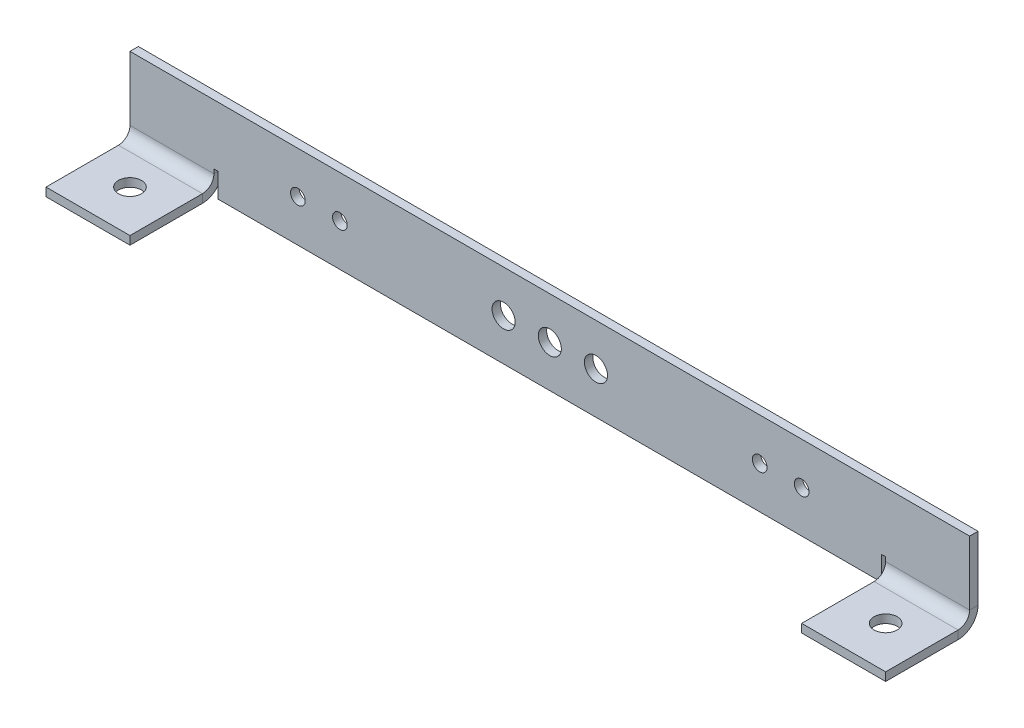
ISO-10303-21;
HEADER;
FILE_DESCRIPTION(('STEP AP214'),'2;1');
FILE_NAME('part.step','',(''),(''),'','','');
FILE_SCHEMA(('AUTOMOTIVE_DESIGN { 1 0 10303 214 1 1 1 1 }'));
ENDSEC;
DATA;
#1=APPLICATION_CONTEXT('core data for automotive mechanical design processes');
#2=APPLICATION_PROTOCOL_DEFINITION('international standard','automotive_design',2000,#1);
#3=PRODUCT_CONTEXT('',#1,'mechanical');
#4=PRODUCT('Part','Part','',(#3));
#5=PRODUCT_RELATED_PRODUCT_CATEGORY('part','',(#4));
#6=PRODUCT_DEFINITION_FORMATION('','',#4);
#7=PRODUCT_DEFINITION_CONTEXT('part definition',#1,'design');
#8=PRODUCT_DEFINITION('design','',#6,#7);
#9=PRODUCT_DEFINITION_SHAPE('','',#8);
#10=(LENGTH_UNIT() NAMED_UNIT(*) SI_UNIT(.MILLI.,.METRE.));
#11=(NAMED_UNIT(*) PLANE_ANGLE_UNIT() SI_UNIT($,.RADIAN.));
#12=(NAMED_UNIT(*) SI_UNIT($,.STERADIAN.) SOLID_ANGLE_UNIT());
#13=UNCERTAINTY_MEASURE_WITH_UNIT(LENGTH_MEASURE(1.E-05),#10,'distance_accuracy_value','');
#14=(GEOMETRIC_REPRESENTATION_CONTEXT(3) GLOBAL_UNCERTAINTY_ASSIGNED_CONTEXT((#13)) GLOBAL_UNIT_ASSIGNED_CONTEXT((#10,
#11,#12)) REPRESENTATION_CONTEXT('',''));
#15=CARTESIAN_POINT('',(0.,0.,0.));
#16=DIRECTION('',(0.,0.,1.));
#17=DIRECTION('',(1.,0.,0.));
#18=AXIS2_PLACEMENT_3D('',#15,#16,#17);
#19=CARTESIAN_POINT('',(100.,-20.,-2.));
#20=DIRECTION('',(0.,-1.,0.));
#21=DIRECTION('',(0.,0.,-1.));
#22=AXIS2_PLACEMENT_3D('',#19,#20,#21);
#23=PLANE('',#22);
#24=DIRECTION('',(1.,0.,0.));
#25=VECTOR('',#24,1.);
#26=CARTESIAN_POINT('',(100.,-20.,-2.));
#27=LINE('',#26,#25);
#28=CARTESIAN_POINT('',(-79.,-20.,-2.));
#29=VERTEX_POINT('',#28);
#30=CARTESIAN_POINT('',(79.,-20.,-2.));
#31=VERTEX_POINT('',#30);
#32=EDGE_CURVE('E358',#29,#31,#27,.T.);
#33=ORIENTED_EDGE('',*,*,#32,.T.);
#34=DIRECTION('',(0.,0.,-1.));
#35=VECTOR('',#34,1.);
#36=CARTESIAN_POINT('',(79.,-20.,0.));
#37=LINE('',#36,#35);
#38=CARTESIAN_POINT('',(79.,-20.,0.));
#39=VERTEX_POINT('',#38);
#40=EDGE_CURVE('E254',#39,#31,#37,.T.);
#41=ORIENTED_EDGE('',*,*,#40,.F.);
#42=DIRECTION('',(1.,0.,0.));
#43=VECTOR('',#42,1.);
#44=CARTESIAN_POINT('',(100.,-20.,0.));
#45=LINE('',#44,#43);
#46=CARTESIAN_POINT('',(-79.,-20.,0.));
#47=VERTEX_POINT('',#46);
#48=EDGE_CURVE('E129',#47,#39,#45,.T.);
#49=ORIENTED_EDGE('',*,*,#48,.F.);
#50=DIRECTION('',(0.,0.,-1.));
#51=VECTOR('',#50,1.);
#52=CARTESIAN_POINT('',(-79.,-20.,0.));
#53=LINE('',#52,#51);
#54=EDGE_CURVE('E339',#47,#29,#53,.T.);
#55=ORIENTED_EDGE('',*,*,#54,.T.);
#56=EDGE_LOOP('',(#33,#41,#49,#55));
#57=FACE_BOUND('',#56,.T.);
#58=ADVANCED_FACE('F78',(#57),#23,.T.);
#59=CARTESIAN_POINT('',(0.,0.,-2.));
#60=DIRECTION('',(0.,0.,1.));
#61=DIRECTION('',(1.,0.,0.));
#62=AXIS2_PLACEMENT_3D('',#59,#60,#61);
#63=PLANE('',#62);
#64=CARTESIAN_POINT('',(-50.,-10.,-2.));
#65=DIRECTION('',(0.,0.,-1.));
#66=DIRECTION('',(1.,0.,0.));
#67=AXIS2_PLACEMENT_3D('',#64,#65,#66);
#68=CIRCLE('',#67,1.75);
#69=CARTESIAN_POINT('',(-48.25,-10.,-2.));
#70=VERTEX_POINT('',#69);
#71=EDGE_CURVE('E657',#70,#70,#68,.T.);
#72=ORIENTED_EDGE('',*,*,#71,.F.);
#73=EDGE_LOOP('',(#72));
#74=FACE_BOUND('',#73,.T.);
#75=CARTESIAN_POINT('',(-60.,-10.,-2.));
#76=DIRECTION('',(0.,0.,-1.));
#77=DIRECTION('',(1.,0.,0.));
#78=AXIS2_PLACEMENT_3D('',#75,#76,#77);
#79=CIRCLE('',#78,1.75);
#80=CARTESIAN_POINT('',(-58.25,-10.,-2.));
#81=VERTEX_POINT('',#80);
#82=EDGE_CURVE('E652',#81,#81,#79,.T.);
#83=ORIENTED_EDGE('',*,*,#82,.F.);
#84=EDGE_LOOP('',(#83));
#85=FACE_BOUND('',#84,.T.);
#86=CARTESIAN_POINT('',(50.,-10.,-2.));
#87=DIRECTION('',(0.,0.,-1.));
#88=DIRECTION('',(-1.,0.,0.));
#89=AXIS2_PLACEMENT_3D('',#86,#87,#88);
#90=CIRCLE('',#89,1.75);
#91=CARTESIAN_POINT('',(48.25,-10.,-2.));
#92=VERTEX_POINT('',#91);
#93=EDGE_CURVE('E649',#92,#92,#90,.T.);
#94=ORIENTED_EDGE('',*,*,#93,.F.);
#95=EDGE_LOOP('',(#94));
#96=FACE_BOUND('',#95,.T.);
#97=CARTESIAN_POINT('',(11.,-10.,-2.));
#98=DIRECTION('',(0.,0.,-1.));
#99=DIRECTION('',(-1.,0.,0.));
#100=AXIS2_PLACEMENT_3D('',#97,#98,#99);
#101=CIRCLE('',#100,2.75);
#102=CARTESIAN_POINT('',(8.25,-10.,-2.));
#103=VERTEX_POINT('',#102);
#104=EDGE_CURVE('E158',#103,#103,#101,.T.);
#105=ORIENTED_EDGE('',*,*,#104,.F.);
#106=EDGE_LOOP('',(#105));
#107=FACE_BOUND('',#106,.T.);
#108=CARTESIAN_POINT('',(-11.,-10.,-2.));
#109=DIRECTION('',(0.,0.,-1.));
#110=DIRECTION('',(1.,0.,0.));
#111=AXIS2_PLACEMENT_3D('',#108,#109,#110);
#112=CIRCLE('',#111,2.75);
#113=CARTESIAN_POINT('',(-8.25,-10.,-2.));
#114=VERTEX_POINT('',#113);
#115=EDGE_CURVE('E655',#114,#114,#112,.T.);
#116=ORIENTED_EDGE('',*,*,#115,.F.);
#117=EDGE_LOOP('',(#116));
#118=FACE_BOUND('',#117,.T.);
#119=CARTESIAN_POINT('',(60.,-10.,-2.));
#120=DIRECTION('',(0.,0.,-1.));
#121=DIRECTION('',(-1.,0.,0.));
#122=AXIS2_PLACEMENT_3D('',#119,#120,#121);
#123=CIRCLE('',#122,1.75);
#124=CARTESIAN_POINT('',(58.25,-10.,-2.));
#125=VERTEX_POINT('',#124);
#126=EDGE_CURVE('E651',#125,#125,#123,.T.);
#127=ORIENTED_EDGE('',*,*,#126,.F.);
#128=EDGE_LOOP('',(#127));
#129=FACE_BOUND('',#128,.T.);
#130=CARTESIAN_POINT('',(0.,-10.,-2.));
#131=DIRECTION('',(0.,0.,-1.));
#132=DIRECTION('',(-1.,0.,0.));
#133=AXIS2_PLACEMENT_3D('',#130,#131,#132);
#134=CIRCLE('',#133,2.75);
#135=CARTESIAN_POINT('',(-2.75,-10.,-2.));
#136=VERTEX_POINT('',#135);
#137=EDGE_CURVE('E153',#136,#136,#134,.T.);
#138=ORIENTED_EDGE('',*,*,#137,.F.);
#139=EDGE_LOOP('',(#138));
#140=FACE_BOUND('',#139,.T.);
#141=DIRECTION('',(1.,0.,0.));
#142=VECTOR('',#141,1.);
#143=CARTESIAN_POINT('',(100.,-15.2634,-2.));
#144=LINE('',#143,#142);
#145=CARTESIAN_POINT('',(100.,-15.2634,-2.));
#146=VERTEX_POINT('',#145);
#147=CARTESIAN_POINT('',(80.,-15.2634,-2.));
#148=VERTEX_POINT('',#147);
#149=EDGE_CURVE('E222',#146,#148,#144,.F.);
#150=ORIENTED_EDGE('',*,*,#149,.T.);
#151=DIRECTION('',(0.,-1.,0.));
#152=VECTOR('',#151,1.);
#153=CARTESIAN_POINT('',(80.,0.,-2.));
#154=LINE('',#153,#152);
#155=CARTESIAN_POINT('',(80.,-14.2634,-2.));
#156=VERTEX_POINT('',#155);
#157=EDGE_CURVE('E266',#156,#148,#154,.T.);
#158=ORIENTED_EDGE('',*,*,#157,.F.);
#159=DIRECTION('',(1.,0.,0.));
#160=VECTOR('',#159,1.);
#161=CARTESIAN_POINT('',(0.,-14.2634,-2.));
#162=LINE('',#161,#160);
#163=CARTESIAN_POINT('',(79.,-14.2634,-2.));
#164=VERTEX_POINT('',#163);
#165=EDGE_CURVE('E263',#164,#156,#162,.T.);
#166=ORIENTED_EDGE('',*,*,#165,.F.);
#167=DIRECTION('',(0.,1.,0.));
#168=VECTOR('',#167,1.);
#169=CARTESIAN_POINT('',(79.,0.,-2.));
#170=LINE('',#169,#168);
#171=EDGE_CURVE('E246',#31,#164,#170,.T.);
#172=ORIENTED_EDGE('',*,*,#171,.F.);
#173=ORIENTED_EDGE('',*,*,#32,.F.);
#174=DIRECTION('',(0.,-1.,0.));
#175=VECTOR('',#174,1.);
#176=CARTESIAN_POINT('',(-79.,-1.91114115820755E-13,-2.));
#177=LINE('',#176,#175);
#178=CARTESIAN_POINT('',(-79.,-14.2634,-2.));
#179=VERTEX_POINT('',#178);
#180=EDGE_CURVE('E137',#179,#29,#177,.T.);
#181=ORIENTED_EDGE('',*,*,#180,.F.);
#182=DIRECTION('',(1.,0.,0.));
#183=VECTOR('',#182,1.);
#184=CARTESIAN_POINT('',(0.,-14.2634,-2.));
#185=LINE('',#184,#183);
#186=CARTESIAN_POINT('',(-80.,-14.2634,-2.));
#187=VERTEX_POINT('',#186);
#188=EDGE_CURVE('E141',#187,#179,#185,.T.);
#189=ORIENTED_EDGE('',*,*,#188,.F.);
#190=DIRECTION('',(0.,1.,0.));
#191=VECTOR('',#190,1.);
#192=CARTESIAN_POINT('',(-80.,0.,-2.));
#193=LINE('',#192,#191);
#194=CARTESIAN_POINT('',(-80.,-15.2634,-2.));
#195=VERTEX_POINT('',#194);
#196=EDGE_CURVE('E338',#195,#187,#193,.T.);
#197=ORIENTED_EDGE('',*,*,#196,.F.);
#198=DIRECTION('',(1.,0.,0.));
#199=VECTOR('',#198,1.);
#200=CARTESIAN_POINT('',(-80.,-15.2634,-2.));
#201=LINE('',#200,#199);
#202=CARTESIAN_POINT('',(-100.,-15.2634,-2.));
#203=VERTEX_POINT('',#202);
#204=EDGE_CURVE('E312',#195,#203,#201,.F.);
#205=ORIENTED_EDGE('',*,*,#204,.T.);
#206=DIRECTION('',(0.,-1.,0.));
#207=VECTOR('',#206,1.);
#208=CARTESIAN_POINT('',(-100.,-20.,-2.));
#209=LINE('',#208,#207);
#210=CARTESIAN_POINT('',(-100.,0.,-2.));
#211=VERTEX_POINT('',#210);
#212=EDGE_CURVE('E356',#211,#203,#209,.T.);
#213=ORIENTED_EDGE('',*,*,#212,.F.);
#214=DIRECTION('',(-1.,0.,0.));
#215=VECTOR('',#214,1.);
#216=CARTESIAN_POINT('',(-100.,0.,-2.));
#217=LINE('',#216,#215);
#218=CARTESIAN_POINT('',(100.,0.,-2.));
#219=VERTEX_POINT('',#218);
#220=EDGE_CURVE('E128',#219,#211,#217,.T.);
#221=ORIENTED_EDGE('',*,*,#220,.F.);
#222=DIRECTION('',(0.,1.,0.));
#223=VECTOR('',#222,1.);
#224=CARTESIAN_POINT('',(100.,-20.,-2.));
#225=LINE('',#224,#223);
#226=EDGE_CURVE('E103',#146,#219,#225,.T.);
#227=ORIENTED_EDGE('',*,*,#226,.F.);
#228=EDGE_LOOP('',(#150,#158,#166,#172,#173,#181,#189,#197,#205,#213,#221,#227));
#229=FACE_BOUND('',#228,.T.);
#230=ADVANCED_FACE('F373',(#74,#85,#96,#107,#118,#129,#140,#229),#63,.F.);
#231=CARTESIAN_POINT('',(0.,0.,0.));
#232=DIRECTION('',(0.,0.,1.));
#233=DIRECTION('',(1.,0.,0.));
#234=AXIS2_PLACEMENT_3D('',#231,#232,#233);
#235=PLANE('',#234);
#236=CARTESIAN_POINT('',(-50.,-10.,0.));
#237=DIRECTION('',(0.,0.,1.));
#238=DIRECTION('',(1.,0.,0.));
#239=AXIS2_PLACEMENT_3D('',#236,#237,#238);
#240=CIRCLE('',#239,1.75);
#241=CARTESIAN_POINT('',(-48.25,-10.,0.));
#242=VERTEX_POINT('',#241);
#243=EDGE_CURVE('E82',#242,#242,#240,.T.);
#244=ORIENTED_EDGE('',*,*,#243,.F.);
#245=EDGE_LOOP('',(#244));
#246=FACE_BOUND('',#245,.T.);
#247=CARTESIAN_POINT('',(-60.,-10.,0.));
#248=DIRECTION('',(0.,0.,1.));
#249=DIRECTION('',(1.,0.,0.));
#250=AXIS2_PLACEMENT_3D('',#247,#248,#249);
#251=CIRCLE('',#250,1.75);
#252=CARTESIAN_POINT('',(-58.25,-10.,0.));
#253=VERTEX_POINT('',#252);
#254=EDGE_CURVE('E166',#253,#253,#251,.T.);
#255=ORIENTED_EDGE('',*,*,#254,.F.);
#256=EDGE_LOOP('',(#255));
#257=FACE_BOUND('',#256,.T.);
#258=CARTESIAN_POINT('',(50.,-10.,0.));
#259=DIRECTION('',(0.,0.,1.));
#260=DIRECTION('',(1.,0.,0.));
#261=AXIS2_PLACEMENT_3D('',#258,#259,#260);
#262=CIRCLE('',#261,1.75);
#263=CARTESIAN_POINT('',(51.75,-10.,0.));
#264=VERTEX_POINT('',#263);
#265=EDGE_CURVE('E164',#264,#264,#262,.T.);
#266=ORIENTED_EDGE('',*,*,#265,.F.);
#267=EDGE_LOOP('',(#266));
#268=FACE_BOUND('',#267,.T.);
#269=CARTESIAN_POINT('',(11.,-10.,0.));
#270=DIRECTION('',(0.,0.,1.));
#271=DIRECTION('',(1.,0.,0.));
#272=AXIS2_PLACEMENT_3D('',#269,#270,#271);
#273=CIRCLE('',#272,2.75);
#274=CARTESIAN_POINT('',(13.75,-10.,0.));
#275=VERTEX_POINT('',#274);
#276=EDGE_CURVE('E161',#275,#275,#273,.T.);
#277=ORIENTED_EDGE('',*,*,#276,.F.);
#278=EDGE_LOOP('',(#277));
#279=FACE_BOUND('',#278,.T.);
#280=CARTESIAN_POINT('',(-11.,-10.,0.));
#281=DIRECTION('',(0.,0.,1.));
#282=DIRECTION('',(1.,0.,0.));
#283=AXIS2_PLACEMENT_3D('',#280,#281,#282);
#284=CIRCLE('',#283,2.75);
#285=CARTESIAN_POINT('',(-8.25,-10.,0.));
#286=VERTEX_POINT('',#285);
#287=EDGE_CURVE('E157',#286,#286,#284,.T.);
#288=ORIENTED_EDGE('',*,*,#287,.F.);
#289=EDGE_LOOP('',(#288));
#290=FACE_BOUND('',#289,.T.);
#291=CARTESIAN_POINT('',(60.,-10.,0.));
#292=DIRECTION('',(0.,0.,1.));
#293=DIRECTION('',(1.,0.,0.));
#294=AXIS2_PLACEMENT_3D('',#291,#292,#293);
#295=CIRCLE('',#294,1.75);
#296=CARTESIAN_POINT('',(61.75,-10.,0.));
#297=VERTEX_POINT('',#296);
#298=EDGE_CURVE('E154',#297,#297,#295,.T.);
#299=ORIENTED_EDGE('',*,*,#298,.F.);
#300=EDGE_LOOP('',(#299));
#301=FACE_BOUND('',#300,.T.);
#302=CARTESIAN_POINT('',(0.,-10.,0.));
#303=DIRECTION('',(0.,0.,1.));
#304=DIRECTION('',(1.,0.,0.));
#305=AXIS2_PLACEMENT_3D('',#302,#303,#304);
#306=CIRCLE('',#305,2.75);
#307=CARTESIAN_POINT('',(2.75,-10.,0.));
#308=VERTEX_POINT('',#307);
#309=EDGE_CURVE('E149',#308,#308,#306,.T.);
#310=ORIENTED_EDGE('',*,*,#309,.F.);
#311=EDGE_LOOP('',(#310));
#312=FACE_BOUND('',#311,.T.);
#313=DIRECTION('',(0.,1.,0.));
#314=VECTOR('',#313,1.);
#315=CARTESIAN_POINT('',(80.,-15.2634,0.));
#316=LINE('',#315,#314);
#317=CARTESIAN_POINT('',(80.,-15.2634,0.));
#318=VERTEX_POINT('',#317);
#319=CARTESIAN_POINT('',(80.,-14.2634,0.));
#320=VERTEX_POINT('',#319);
#321=EDGE_CURVE('E243',#318,#320,#316,.T.);
#322=ORIENTED_EDGE('',*,*,#321,.F.);
#323=DIRECTION('',(1.,0.,0.));
#324=VECTOR('',#323,1.);
#325=CARTESIAN_POINT('',(100.,-15.2634,0.));
#326=LINE('',#325,#324);
#327=CARTESIAN_POINT('',(100.,-15.2634,0.));
#328=VERTEX_POINT('',#327);
#329=EDGE_CURVE('E126',#328,#318,#326,.F.);
#330=ORIENTED_EDGE('',*,*,#329,.F.);
#331=DIRECTION('',(0.,1.,0.));
#332=VECTOR('',#331,1.);
#333=CARTESIAN_POINT('',(100.,-20.,0.));
#334=LINE('',#333,#332);
#335=CARTESIAN_POINT('',(100.,0.,0.));
#336=VERTEX_POINT('',#335);
#337=EDGE_CURVE('E118',#328,#336,#334,.T.);
#338=ORIENTED_EDGE('',*,*,#337,.T.);
#339=DIRECTION('',(-1.,0.,0.));
#340=VECTOR('',#339,1.);
#341=CARTESIAN_POINT('',(-100.,0.,0.));
#342=LINE('',#341,#340);
#343=CARTESIAN_POINT('',(-100.,0.,0.));
#344=VERTEX_POINT('',#343);
#345=EDGE_CURVE('E123',#336,#344,#342,.T.);
#346=ORIENTED_EDGE('',*,*,#345,.T.);
#347=DIRECTION('',(0.,-1.,0.));
#348=VECTOR('',#347,1.);
#349=CARTESIAN_POINT('',(-100.,-20.,0.));
#350=LINE('',#349,#348);
#351=CARTESIAN_POINT('',(-100.,-15.2634,0.));
#352=VERTEX_POINT('',#351);
#353=EDGE_CURVE('E136',#344,#352,#350,.T.);
#354=ORIENTED_EDGE('',*,*,#353,.T.);
#355=DIRECTION('',(1.,0.,0.));
#356=VECTOR('',#355,1.);
#357=CARTESIAN_POINT('',(-80.,-15.2634,0.));
#358=LINE('',#357,#356);
#359=CARTESIAN_POINT('',(-80.,-15.2634,0.));
#360=VERTEX_POINT('',#359);
#361=EDGE_CURVE('E325',#360,#352,#358,.F.);
#362=ORIENTED_EDGE('',*,*,#361,.F.);
#363=DIRECTION('',(0.,-1.,0.));
#364=VECTOR('',#363,1.);
#365=CARTESIAN_POINT('',(-80.,-14.2634,0.));
#366=LINE('',#365,#364);
#367=CARTESIAN_POINT('',(-80.,-14.2634,0.));
#368=VERTEX_POINT('',#367);
#369=EDGE_CURVE('E95',#368,#360,#366,.T.);
#370=ORIENTED_EDGE('',*,*,#369,.F.);
#371=DIRECTION('',(-1.,0.,0.));
#372=VECTOR('',#371,1.);
#373=CARTESIAN_POINT('',(-79.,-14.2634,0.));
#374=LINE('',#373,#372);
#375=CARTESIAN_POINT('',(-79.,-14.2634,0.));
#376=VERTEX_POINT('',#375);
#377=EDGE_CURVE('E340',#376,#368,#374,.T.);
#378=ORIENTED_EDGE('',*,*,#377,.F.);
#379=DIRECTION('',(0.,1.,0.));
#380=VECTOR('',#379,1.);
#381=CARTESIAN_POINT('',(-79.,-20.,0.));
#382=LINE('',#381,#380);
#383=EDGE_CURVE('E335',#47,#376,#382,.T.);
#384=ORIENTED_EDGE('',*,*,#383,.F.);
#385=ORIENTED_EDGE('',*,*,#48,.T.);
#386=DIRECTION('',(0.,-1.,0.));
#387=VECTOR('',#386,1.);
#388=CARTESIAN_POINT('',(79.,-14.2634,0.));
#389=LINE('',#388,#387);
#390=CARTESIAN_POINT('',(79.,-14.2634,0.));
#391=VERTEX_POINT('',#390);
#392=EDGE_CURVE('E251',#391,#39,#389,.T.);
#393=ORIENTED_EDGE('',*,*,#392,.F.);
#394=DIRECTION('',(-1.,0.,0.));
#395=VECTOR('',#394,1.);
#396=CARTESIAN_POINT('',(80.,-14.2634,0.));
#397=LINE('',#396,#395);
#398=EDGE_CURVE('E247',#320,#391,#397,.T.);
#399=ORIENTED_EDGE('',*,*,#398,.F.);
#400=EDGE_LOOP('',(#322,#330,#338,#346,#354,#362,#370,#378,#384,#385,#393,#399));
#401=FACE_BOUND('',#400,.T.);
#402=ADVANCED_FACE('F120',(#246,#257,#268,#279,#290,#301,#312,#401),#235,.T.);
#403=CARTESIAN_POINT('',(100.,-20.,-2.));
#404=DIRECTION('',(1.,0.,0.));
#405=DIRECTION('',(0.,1.,0.));
#406=AXIS2_PLACEMENT_3D('',#403,#404,#405);
#407=PLANE('',#406);
#408=ORIENTED_EDGE('',*,*,#337,.F.);
#409=DIRECTION('',(0.,0.,-1.));
#410=VECTOR('',#409,1.);
#411=CARTESIAN_POINT('',(100.,-15.2634,0.));
#412=LINE('',#411,#410);
#413=EDGE_CURVE('E229',#328,#146,#412,.T.);
#414=ORIENTED_EDGE('',*,*,#413,.T.);
#415=ORIENTED_EDGE('',*,*,#226,.T.);
#416=DIRECTION('',(0.,0.,1.));
#417=VECTOR('',#416,1.);
#418=CARTESIAN_POINT('',(100.,0.,-2.));
#419=LINE('',#418,#417);
#420=EDGE_CURVE('E13',#219,#336,#419,.T.);
#421=ORIENTED_EDGE('',*,*,#420,.T.);
#422=EDGE_LOOP('',(#408,#414,#415,#421));
#423=FACE_BOUND('',#422,.T.);
#424=ADVANCED_FACE('F131',(#423),#407,.T.);
#425=CARTESIAN_POINT('',(-100.,0.,-2.));
#426=DIRECTION('',(0.,1.,0.));
#427=DIRECTION('',(0.,0.,1.));
#428=AXIS2_PLACEMENT_3D('',#425,#426,#427);
#429=PLANE('',#428);
#430=ORIENTED_EDGE('',*,*,#345,.F.);
#431=ORIENTED_EDGE('',*,*,#420,.F.);
#432=ORIENTED_EDGE('',*,*,#220,.T.);
#433=DIRECTION('',(0.,0.,1.));
#434=VECTOR('',#433,1.);
#435=CARTESIAN_POINT('',(-100.,0.,-2.));
#436=LINE('',#435,#434);
#437=EDGE_CURVE('E87',#211,#344,#436,.T.);
#438=ORIENTED_EDGE('',*,*,#437,.T.);
#439=EDGE_LOOP('',(#430,#431,#432,#438));
#440=FACE_BOUND('',#439,.T.);
#441=ADVANCED_FACE('F80',(#440),#429,.T.);
#442=CARTESIAN_POINT('',(-100.,-20.,-2.));
#443=DIRECTION('',(-1.,0.,0.));
#444=DIRECTION('',(0.,-1.,0.));
#445=AXIS2_PLACEMENT_3D('',#442,#443,#444);
#446=PLANE('',#445);
#447=DIRECTION('',(0.,0.,-1.));
#448=VECTOR('',#447,1.);
#449=CARTESIAN_POINT('',(-100.,-15.2634,0.));
#450=LINE('',#449,#448);
#451=EDGE_CURVE('E330',#352,#203,#450,.T.);
#452=ORIENTED_EDGE('',*,*,#451,.F.);
#453=ORIENTED_EDGE('',*,*,#353,.F.);
#454=ORIENTED_EDGE('',*,*,#437,.F.);
#455=ORIENTED_EDGE('',*,*,#212,.T.);
#456=EDGE_LOOP('',(#452,#453,#454,#455));
#457=FACE_BOUND('',#456,.T.);
#458=ADVANCED_FACE('F506',(#457),#446,.T.);
#459=CARTESIAN_POINT('',(-79.,-20.,0.));
#460=DIRECTION('',(-1.,0.,0.));
#461=DIRECTION('',(0.,-1.,0.));
#462=AXIS2_PLACEMENT_3D('',#459,#460,#461);
#463=PLANE('',#462);
#464=DIRECTION('',(0.,0.,-1.));
#465=VECTOR('',#464,1.);
#466=CARTESIAN_POINT('',(-79.,-14.2634,0.));
#467=LINE('',#466,#465);
#468=EDGE_CURVE('E343',#376,#179,#467,.T.);
#469=ORIENTED_EDGE('',*,*,#468,.T.);
#470=ORIENTED_EDGE('',*,*,#180,.T.);
#471=ORIENTED_EDGE('',*,*,#54,.F.);
#472=ORIENTED_EDGE('',*,*,#383,.T.);
#473=EDGE_LOOP('',(#469,#470,#471,#472));
#474=FACE_BOUND('',#473,.T.);
#475=ADVANCED_FACE('F508',(#474),#463,.T.);
#476=CARTESIAN_POINT('',(-79.,-14.2634,0.));
#477=DIRECTION('',(0.,-1.,0.));
#478=DIRECTION('',(0.,0.,-1.));
#479=AXIS2_PLACEMENT_3D('',#476,#477,#478);
#480=PLANE('',#479);
#481=DIRECTION('',(0.,0.,-1.));
#482=VECTOR('',#481,1.);
#483=CARTESIAN_POINT('',(-80.,-14.2634,0.));
#484=LINE('',#483,#482);
#485=EDGE_CURVE('E333',#368,#187,#484,.T.);
#486=ORIENTED_EDGE('',*,*,#485,.T.);
#487=ORIENTED_EDGE('',*,*,#188,.T.);
#488=ORIENTED_EDGE('',*,*,#468,.F.);
#489=ORIENTED_EDGE('',*,*,#377,.T.);
#490=EDGE_LOOP('',(#486,#487,#488,#489));
#491=FACE_BOUND('',#490,.T.);
#492=ADVANCED_FACE('F514',(#491),#480,.T.);
#493=CARTESIAN_POINT('',(-80.,-14.2634,0.));
#494=DIRECTION('',(1.,0.,0.));
#495=DIRECTION('',(0.,0.,-1.));
#496=AXIS2_PLACEMENT_3D('',#493,#494,#495);
#497=PLANE('',#496);
#498=DIRECTION('',(0.,0.,-1.));
#499=VECTOR('',#498,1.);
#500=CARTESIAN_POINT('',(-80.,-15.2634,0.));
#501=LINE('',#500,#499);
#502=EDGE_CURVE('E319',#360,#195,#501,.T.);
#503=ORIENTED_EDGE('',*,*,#502,.T.);
#504=ORIENTED_EDGE('',*,*,#196,.T.);
#505=ORIENTED_EDGE('',*,*,#485,.F.);
#506=ORIENTED_EDGE('',*,*,#369,.T.);
#507=EDGE_LOOP('',(#503,#504,#505,#506));
#508=FACE_BOUND('',#507,.T.);
#509=ADVANCED_FACE('F547',(#508),#497,.T.);
#510=CARTESIAN_POINT('',(-100.,-15.2634,2.7366));
#511=DIRECTION('',(-1.,0.,0.));
#512=DIRECTION('',(0.,0.,1.));
#513=AXIS2_PLACEMENT_3D('',#510,#511,#512);
#514=PLANE('',#513);
#515=DIRECTION('',(0.,-1.,0.));
#516=VECTOR('',#515,1.);
#517=CARTESIAN_POINT('',(-100.,-20.,2.73659999999999));
#518=LINE('',#517,#516);
#519=CARTESIAN_POINT('',(-100.,-18.,2.73659999999999));
#520=VERTEX_POINT('',#519);
#521=CARTESIAN_POINT('',(-100.,-20.,2.73659999999998));
#522=VERTEX_POINT('',#521);
#523=EDGE_CURVE('E275',#520,#522,#518,.T.);
#524=ORIENTED_EDGE('',*,*,#523,.F.);
#525=CARTESIAN_POINT('',(-100.,-15.2634,2.7366));
#526=DIRECTION('',(1.,0.,0.));
#527=DIRECTION('',(0.,0.,-1.));
#528=AXIS2_PLACEMENT_3D('',#525,#526,#527);
#529=CIRCLE('',#528,2.7366);
#530=EDGE_CURVE('E322',#352,#520,#529,.F.);
#531=ORIENTED_EDGE('',*,*,#530,.F.);
#532=ORIENTED_EDGE('',*,*,#451,.T.);
#533=CARTESIAN_POINT('',(-100.,-15.2634,2.7366));
#534=DIRECTION('',(1.,0.,0.));
#535=DIRECTION('',(0.,0.,-1.));
#536=AXIS2_PLACEMENT_3D('',#533,#534,#535);
#537=CIRCLE('',#536,4.7366);
#538=EDGE_CURVE('E315',#203,#522,#537,.F.);
#539=ORIENTED_EDGE('',*,*,#538,.T.);
#540=EDGE_LOOP('',(#524,#531,#532,#539));
#541=FACE_BOUND('',#540,.T.);
#542=ADVANCED_FACE('F525',(#541),#514,.T.);
#543=CARTESIAN_POINT('',(-80.,-15.2634,2.7366));
#544=DIRECTION('',(-1.,0.,0.));
#545=DIRECTION('',(0.,0.,1.));
#546=AXIS2_PLACEMENT_3D('',#543,#544,#545);
#547=PLANE('',#546);
#548=CARTESIAN_POINT('',(-80.,-15.2634,2.7366));
#549=DIRECTION('',(1.,0.,0.));
#550=DIRECTION('',(0.,0.,-1.));
#551=AXIS2_PLACEMENT_3D('',#548,#549,#550);
#552=CIRCLE('',#551,2.7366);
#553=CARTESIAN_POINT('',(-80.,-18.,2.73659999999999));
#554=VERTEX_POINT('',#553);
#555=EDGE_CURVE('E279',#554,#360,#552,.T.);
#556=ORIENTED_EDGE('',*,*,#555,.F.);
#557=DIRECTION('',(0.,-1.,0.));
#558=VECTOR('',#557,1.);
#559=CARTESIAN_POINT('',(-80.,-18.,2.73659999999999));
#560=LINE('',#559,#558);
#561=CARTESIAN_POINT('',(-80.,-20.,2.73659999999998));
#562=VERTEX_POINT('',#561);
#563=EDGE_CURVE('E304',#554,#562,#560,.T.);
#564=ORIENTED_EDGE('',*,*,#563,.T.);
#565=CARTESIAN_POINT('',(-80.,-15.2634,2.7366));
#566=DIRECTION('',(1.,0.,0.));
#567=DIRECTION('',(0.,0.,-1.));
#568=AXIS2_PLACEMENT_3D('',#565,#566,#567);
#569=CIRCLE('',#568,4.7366);
#570=EDGE_CURVE('E316',#562,#195,#569,.T.);
#571=ORIENTED_EDGE('',*,*,#570,.T.);
#572=ORIENTED_EDGE('',*,*,#502,.F.);
#573=EDGE_LOOP('',(#556,#564,#571,#572));
#574=FACE_BOUND('',#573,.T.);
#575=ADVANCED_FACE('F545',(#574),#547,.F.);
#576=CARTESIAN_POINT('',(-80.,-15.2634,2.7366));
#577=DIRECTION('',(1.,0.,0.));
#578=DIRECTION('',(0.,-1.,0.));
#579=AXIS2_PLACEMENT_3D('',#576,#577,#578);
#580=CYLINDRICAL_SURFACE('',#579,4.7366);
#581=ORIENTED_EDGE('',*,*,#204,.F.);
#582=ORIENTED_EDGE('',*,*,#570,.F.);
#583=DIRECTION('',(1.,0.,0.));
#584=VECTOR('',#583,1.);
#585=CARTESIAN_POINT('',(0.,-20.,2.73659999999997));
#586=LINE('',#585,#584);
#587=EDGE_CURVE('E301',#522,#562,#586,.T.);
#588=ORIENTED_EDGE('',*,*,#587,.F.);
#589=ORIENTED_EDGE('',*,*,#538,.F.);
#590=EDGE_LOOP('',(#581,#582,#588,#589));
#591=FACE_BOUND('',#590,.T.);
#592=ADVANCED_FACE('F549',(#591),#580,.T.);
#593=CARTESIAN_POINT('',(-80.,-15.2634,2.7366));
#594=DIRECTION('',(1.,0.,0.));
#595=DIRECTION('',(0.,-1.,0.));
#596=AXIS2_PLACEMENT_3D('',#593,#594,#595);
#597=CYLINDRICAL_SURFACE('',#596,2.7366);
#598=ORIENTED_EDGE('',*,*,#361,.T.);
#599=ORIENTED_EDGE('',*,*,#530,.T.);
#600=DIRECTION('',(-1.,0.,0.));
#601=VECTOR('',#600,1.);
#602=CARTESIAN_POINT('',(-100.,-18.,2.73659999999999));
#603=LINE('',#602,#601);
#604=EDGE_CURVE('E307',#520,#554,#603,.F.);
#605=ORIENTED_EDGE('',*,*,#604,.T.);
#606=ORIENTED_EDGE('',*,*,#555,.T.);
#607=EDGE_LOOP('',(#598,#599,#605,#606));
#608=FACE_BOUND('',#607,.T.);
#609=ADVANCED_FACE('F522',(#608),#597,.F.);
#610=CARTESIAN_POINT('',(-80.,-20.,0.));
#611=DIRECTION('',(1.,0.,0.));
#612=DIRECTION('',(0.,0.,-1.));
#613=AXIS2_PLACEMENT_3D('',#610,#611,#612);
#614=PLANE('',#613);
#615=DIRECTION('',(0.,0.,-1.));
#616=VECTOR('',#615,1.);
#617=CARTESIAN_POINT('',(-80.,-20.,0.));
#618=LINE('',#617,#616);
#619=CARTESIAN_POINT('',(-80.,-20.0000000000001,20.));
#620=VERTEX_POINT('',#619);
#621=EDGE_CURVE('E283',#620,#562,#618,.T.);
#622=ORIENTED_EDGE('',*,*,#621,.T.);
#623=ORIENTED_EDGE('',*,*,#563,.F.);
#624=DIRECTION('',(0.,0.,1.));
#625=VECTOR('',#624,1.);
#626=CARTESIAN_POINT('',(-80.,-18.,0.));
#627=LINE('',#626,#625);
#628=CARTESIAN_POINT('',(-80.,-18.0000000000001,20.));
#629=VERTEX_POINT('',#628);
#630=EDGE_CURVE('E292',#629,#554,#627,.F.);
#631=ORIENTED_EDGE('',*,*,#630,.F.);
#632=DIRECTION('',(0.,1.,0.));
#633=VECTOR('',#632,1.);
#634=CARTESIAN_POINT('',(-80.,-20.0000000000001,20.));
#635=LINE('',#634,#633);
#636=EDGE_CURVE('E276',#620,#629,#635,.T.);
#637=ORIENTED_EDGE('',*,*,#636,.F.);
#638=EDGE_LOOP('',(#622,#623,#631,#637));
#639=FACE_BOUND('',#638,.T.);
#640=ADVANCED_FACE('F543',(#639),#614,.T.);
#641=CARTESIAN_POINT('',(-100.,-20.0000000000001,20.));
#642=DIRECTION('',(-1.,0.,0.));
#643=DIRECTION('',(0.,0.,1.));
#644=AXIS2_PLACEMENT_3D('',#641,#642,#643);
#645=PLANE('',#644);
#646=DIRECTION('',(0.,0.,-1.));
#647=VECTOR('',#646,1.);
#648=CARTESIAN_POINT('',(-100.,-18.,0.));
#649=LINE('',#648,#647);
#650=CARTESIAN_POINT('',(-100.,-18.0000000000001,20.));
#651=VERTEX_POINT('',#650);
#652=EDGE_CURVE('E298',#520,#651,#649,.F.);
#653=ORIENTED_EDGE('',*,*,#652,.F.);
#654=ORIENTED_EDGE('',*,*,#523,.T.);
#655=DIRECTION('',(0.,0.,1.));
#656=VECTOR('',#655,1.);
#657=CARTESIAN_POINT('',(-100.,-20.0000000000001,20.));
#658=LINE('',#657,#656);
#659=CARTESIAN_POINT('',(-100.,-20.0000000000001,20.));
#660=VERTEX_POINT('',#659);
#661=EDGE_CURVE('E289',#522,#660,#658,.T.);
#662=ORIENTED_EDGE('',*,*,#661,.T.);
#663=DIRECTION('',(0.,1.,0.));
#664=VECTOR('',#663,1.);
#665=CARTESIAN_POINT('',(-100.,-20.0000000000001,20.));
#666=LINE('',#665,#664);
#667=EDGE_CURVE('E280',#660,#651,#666,.T.);
#668=ORIENTED_EDGE('',*,*,#667,.T.);
#669=EDGE_LOOP('',(#653,#654,#662,#668));
#670=FACE_BOUND('',#669,.T.);
#671=ADVANCED_FACE('F529',(#670),#645,.T.);
#672=CARTESIAN_POINT('',(0.,-20.,0.));
#673=DIRECTION('',(0.,-1.,0.));
#674=DIRECTION('',(0.,0.,-1.));
#675=AXIS2_PLACEMENT_3D('',#672,#673,#674);
#676=PLANE('',#675);
#677=CARTESIAN_POINT('',(-90.,-20.,9.99999999999999));
#678=DIRECTION('',(0.,-1.,0.));
#679=DIRECTION('',(0.,0.,-1.));
#680=AXIS2_PLACEMENT_3D('',#677,#678,#679);
#681=CIRCLE('',#680,2.75000000000001);
#682=CARTESIAN_POINT('',(-90.,-20.,7.24999999999998));
#683=VERTEX_POINT('',#682);
#684=EDGE_CURVE('E272',#683,#683,#681,.T.);
#685=ORIENTED_EDGE('',*,*,#684,.F.);
#686=EDGE_LOOP('',(#685));
#687=FACE_BOUND('',#686,.T.);
#688=ORIENTED_EDGE('',*,*,#661,.F.);
#689=ORIENTED_EDGE('',*,*,#587,.T.);
#690=ORIENTED_EDGE('',*,*,#621,.F.);
#691=DIRECTION('',(1.,0.,0.));
#692=VECTOR('',#691,1.);
#693=CARTESIAN_POINT('',(-80.,-20.0000000000001,20.));
#694=LINE('',#693,#692);
#695=EDGE_CURVE('E286',#660,#620,#694,.T.);
#696=ORIENTED_EDGE('',*,*,#695,.F.);
#697=EDGE_LOOP('',(#688,#689,#690,#696));
#698=FACE_BOUND('',#697,.T.);
#699=ADVANCED_FACE('F533',(#687,#698),#676,.T.);
#700=CARTESIAN_POINT('',(0.,-18.,0.));
#701=DIRECTION('',(0.,-1.,0.));
#702=DIRECTION('',(0.,0.,-1.));
#703=AXIS2_PLACEMENT_3D('',#700,#701,#702);
#704=PLANE('',#703);
#705=CARTESIAN_POINT('',(-90.,-18.,10.));
#706=DIRECTION('',(0.,1.,0.));
#707=DIRECTION('',(0.,0.,1.));
#708=AXIS2_PLACEMENT_3D('',#705,#706,#707);
#709=CIRCLE('',#708,2.75000000000001);
#710=CARTESIAN_POINT('',(-90.,-18.,12.75));
#711=VERTEX_POINT('',#710);
#712=EDGE_CURVE('E269',#711,#711,#709,.T.);
#713=ORIENTED_EDGE('',*,*,#712,.F.);
#714=EDGE_LOOP('',(#713));
#715=FACE_BOUND('',#714,.T.);
#716=ORIENTED_EDGE('',*,*,#604,.F.);
#717=ORIENTED_EDGE('',*,*,#652,.T.);
#718=DIRECTION('',(-1.,0.,0.));
#719=VECTOR('',#718,1.);
#720=CARTESIAN_POINT('',(0.,-18.0000000000001,20.));
#721=LINE('',#720,#719);
#722=EDGE_CURVE('E295',#651,#629,#721,.F.);
#723=ORIENTED_EDGE('',*,*,#722,.T.);
#724=ORIENTED_EDGE('',*,*,#630,.T.);
#725=EDGE_LOOP('',(#716,#717,#723,#724));
#726=FACE_BOUND('',#725,.T.);
#727=ADVANCED_FACE('F540',(#715,#726),#704,.F.);
#728=CARTESIAN_POINT('',(-80.,-20.0000000000001,20.));
#729=DIRECTION('',(0.,0.,1.));
#730=DIRECTION('',(0.,-1.,0.));
#731=AXIS2_PLACEMENT_3D('',#728,#729,#730);
#732=PLANE('',#731);
#733=ORIENTED_EDGE('',*,*,#722,.F.);
#734=ORIENTED_EDGE('',*,*,#667,.F.);
#735=ORIENTED_EDGE('',*,*,#695,.T.);
#736=ORIENTED_EDGE('',*,*,#636,.T.);
#737=EDGE_LOOP('',(#733,#734,#735,#736));
#738=FACE_BOUND('',#737,.T.);
#739=ADVANCED_FACE('F537',(#738),#732,.T.);
#740=CARTESIAN_POINT('',(-90.,-28.,9.99999999999996));
#741=DIRECTION('',(0.,1.,0.));
#742=DIRECTION('',(0.,0.,1.));
#743=AXIS2_PLACEMENT_3D('',#740,#741,#742);
#744=CYLINDRICAL_SURFACE('',#743,2.75000000000001);
#745=ORIENTED_EDGE('',*,*,#684,.T.);
#746=EDGE_LOOP('',(#745));
#747=FACE_BOUND('',#746,.T.);
#748=ORIENTED_EDGE('',*,*,#712,.T.);
#749=EDGE_LOOP('',(#748));
#750=FACE_BOUND('',#749,.T.);
#751=ADVANCED_FACE('F563',(#747,#750),#744,.F.);
#752=CARTESIAN_POINT('',(80.,-15.2634,0.));
#753=DIRECTION('',(-1.,0.,0.));
#754=DIRECTION('',(0.,0.,1.));
#755=AXIS2_PLACEMENT_3D('',#752,#753,#754);
#756=PLANE('',#755);
#757=DIRECTION('',(0.,0.,-1.));
#758=VECTOR('',#757,1.);
#759=CARTESIAN_POINT('',(80.,-14.2634,0.));
#760=LINE('',#759,#758);
#761=EDGE_CURVE('E250',#320,#156,#760,.T.);
#762=ORIENTED_EDGE('',*,*,#761,.T.);
#763=ORIENTED_EDGE('',*,*,#157,.T.);
#764=DIRECTION('',(0.,0.,-1.));
#765=VECTOR('',#764,1.);
#766=CARTESIAN_POINT('',(80.,-15.2634,0.));
#767=LINE('',#766,#765);
#768=EDGE_CURVE('E238',#318,#148,#767,.T.);
#769=ORIENTED_EDGE('',*,*,#768,.F.);
#770=ORIENTED_EDGE('',*,*,#321,.T.);
#771=EDGE_LOOP('',(#762,#763,#769,#770));
#772=FACE_BOUND('',#771,.T.);
#773=ADVANCED_FACE('F561',(#772),#756,.T.);
#774=CARTESIAN_POINT('',(80.,-14.2634,0.));
#775=DIRECTION('',(0.,-1.,0.));
#776=DIRECTION('',(0.,0.,-1.));
#777=AXIS2_PLACEMENT_3D('',#774,#775,#776);
#778=PLANE('',#777);
#779=DIRECTION('',(0.,0.,-1.));
#780=VECTOR('',#779,1.);
#781=CARTESIAN_POINT('',(79.,-14.2634,0.));
#782=LINE('',#781,#780);
#783=EDGE_CURVE('E241',#391,#164,#782,.T.);
#784=ORIENTED_EDGE('',*,*,#783,.T.);
#785=ORIENTED_EDGE('',*,*,#165,.T.);
#786=ORIENTED_EDGE('',*,*,#761,.F.);
#787=ORIENTED_EDGE('',*,*,#398,.T.);
#788=EDGE_LOOP('',(#784,#785,#786,#787));
#789=FACE_BOUND('',#788,.T.);
#790=ADVANCED_FACE('F558',(#789),#778,.T.);
#791=CARTESIAN_POINT('',(79.,-14.2634,0.));
#792=DIRECTION('',(1.,0.,0.));
#793=DIRECTION('',(0.,0.,-1.));
#794=AXIS2_PLACEMENT_3D('',#791,#792,#793);
#795=PLANE('',#794);
#796=ORIENTED_EDGE('',*,*,#40,.T.);
#797=ORIENTED_EDGE('',*,*,#171,.T.);
#798=ORIENTED_EDGE('',*,*,#783,.F.);
#799=ORIENTED_EDGE('',*,*,#392,.T.);
#800=EDGE_LOOP('',(#796,#797,#798,#799));
#801=FACE_BOUND('',#800,.T.);
#802=ADVANCED_FACE('F556',(#801),#795,.T.);
#803=CARTESIAN_POINT('',(80.,-15.2634,2.7366));
#804=DIRECTION('',(-1.,0.,0.));
#805=DIRECTION('',(0.,0.,1.));
#806=AXIS2_PLACEMENT_3D('',#803,#804,#805);
#807=PLANE('',#806);
#808=DIRECTION('',(0.,1.,0.));
#809=VECTOR('',#808,1.);
#810=CARTESIAN_POINT('',(80.,-20.,2.73659999999998));
#811=LINE('',#810,#809);
#812=CARTESIAN_POINT('',(80.,-18.,2.73659999999999));
#813=VERTEX_POINT('',#812);
#814=CARTESIAN_POINT('',(80.,-20.,2.73659999999998));
#815=VERTEX_POINT('',#814);
#816=EDGE_CURVE('E185',#813,#815,#811,.F.);
#817=ORIENTED_EDGE('',*,*,#816,.F.);
#818=CARTESIAN_POINT('',(80.,-15.2634,2.7366));
#819=DIRECTION('',(1.,0.,0.));
#820=DIRECTION('',(0.,0.,-1.));
#821=AXIS2_PLACEMENT_3D('',#818,#819,#820);
#822=CIRCLE('',#821,2.7366);
#823=EDGE_CURVE('E232',#318,#813,#822,.F.);
#824=ORIENTED_EDGE('',*,*,#823,.F.);
#825=ORIENTED_EDGE('',*,*,#768,.T.);
#826=CARTESIAN_POINT('',(80.,-15.2634,2.7366));
#827=DIRECTION('',(1.,0.,0.));
#828=DIRECTION('',(0.,0.,-1.));
#829=AXIS2_PLACEMENT_3D('',#826,#827,#828);
#830=CIRCLE('',#829,4.7366);
#831=EDGE_CURVE('E225',#148,#815,#830,.F.);
#832=ORIENTED_EDGE('',*,*,#831,.T.);
#833=EDGE_LOOP('',(#817,#824,#825,#832));
#834=FACE_BOUND('',#833,.T.);
#835=ADVANCED_FACE('F478',(#834),#807,.T.);
#836=CARTESIAN_POINT('',(100.,-15.2634,2.7366));
#837=DIRECTION('',(-1.,0.,0.));
#838=DIRECTION('',(0.,0.,1.));
#839=AXIS2_PLACEMENT_3D('',#836,#837,#838);
#840=PLANE('',#839);
#841=CARTESIAN_POINT('',(100.,-15.2634,2.7366));
#842=DIRECTION('',(1.,0.,0.));
#843=DIRECTION('',(0.,0.,-1.));
#844=AXIS2_PLACEMENT_3D('',#841,#842,#843);
#845=CIRCLE('',#844,2.7366);
#846=CARTESIAN_POINT('',(100.,-18.,2.73659999999999));
#847=VERTEX_POINT('',#846);
#848=EDGE_CURVE('E189',#847,#328,#845,.T.);
#849=ORIENTED_EDGE('',*,*,#848,.F.);
#850=DIRECTION('',(0.,1.,0.));
#851=VECTOR('',#850,1.);
#852=CARTESIAN_POINT('',(100.,-18.,2.73659999999999));
#853=LINE('',#852,#851);
#854=CARTESIAN_POINT('',(100.,-20.,2.73659999999999));
#855=VERTEX_POINT('',#854);
#856=EDGE_CURVE('E214',#847,#855,#853,.F.);
#857=ORIENTED_EDGE('',*,*,#856,.T.);
#858=CARTESIAN_POINT('',(100.,-15.2634,2.7366));
#859=DIRECTION('',(1.,0.,0.));
#860=DIRECTION('',(0.,0.,-1.));
#861=AXIS2_PLACEMENT_3D('',#858,#859,#860);
#862=CIRCLE('',#861,4.7366);
#863=EDGE_CURVE('E226',#855,#146,#862,.T.);
#864=ORIENTED_EDGE('',*,*,#863,.T.);
#865=ORIENTED_EDGE('',*,*,#413,.F.);
#866=EDGE_LOOP('',(#849,#857,#864,#865));
#867=FACE_BOUND('',#866,.T.);
#868=ADVANCED_FACE('F459',(#867),#840,.F.);
#869=CARTESIAN_POINT('',(100.,-15.2634,2.7366));
#870=DIRECTION('',(1.,0.,0.));
#871=DIRECTION('',(0.,-1.,0.));
#872=AXIS2_PLACEMENT_3D('',#869,#870,#871);
#873=CYLINDRICAL_SURFACE('',#872,4.7366);
#874=ORIENTED_EDGE('',*,*,#149,.F.);
#875=ORIENTED_EDGE('',*,*,#863,.F.);
#876=DIRECTION('',(1.,0.,0.));
#877=VECTOR('',#876,1.);
#878=CARTESIAN_POINT('',(0.,-20.,2.73659999999997));
#879=LINE('',#878,#877);
#880=EDGE_CURVE('E211',#815,#855,#879,.T.);
#881=ORIENTED_EDGE('',*,*,#880,.F.);
#882=ORIENTED_EDGE('',*,*,#831,.F.);
#883=EDGE_LOOP('',(#874,#875,#881,#882));
#884=FACE_BOUND('',#883,.T.);
#885=ADVANCED_FACE('F454',(#884),#873,.T.);
#886=CARTESIAN_POINT('',(100.,-15.2634,2.7366));
#887=DIRECTION('',(1.,0.,0.));
#888=DIRECTION('',(0.,-1.,0.));
#889=AXIS2_PLACEMENT_3D('',#886,#887,#888);
#890=CYLINDRICAL_SURFACE('',#889,2.7366);
#891=ORIENTED_EDGE('',*,*,#329,.T.);
#892=ORIENTED_EDGE('',*,*,#823,.T.);
#893=DIRECTION('',(-1.,0.,0.));
#894=VECTOR('',#893,1.);
#895=CARTESIAN_POINT('',(80.,-18.,2.73659999999999));
#896=LINE('',#895,#894);
#897=EDGE_CURVE('E217',#813,#847,#896,.F.);
#898=ORIENTED_EDGE('',*,*,#897,.T.);
#899=ORIENTED_EDGE('',*,*,#848,.T.);
#900=EDGE_LOOP('',(#891,#892,#898,#899));
#901=FACE_BOUND('',#900,.T.);
#902=ADVANCED_FACE('F481',(#901),#890,.F.);
#903=CARTESIAN_POINT('',(100.,-20.0000000000001,20.));
#904=DIRECTION('',(-1.,0.,0.));
#905=DIRECTION('',(0.,0.,1.));
#906=AXIS2_PLACEMENT_3D('',#903,#904,#905);
#907=PLANE('',#906);
#908=ORIENTED_EDGE('',*,*,#856,.F.);
#909=DIRECTION('',(0.,0.,1.));
#910=VECTOR('',#909,1.);
#911=CARTESIAN_POINT('',(100.,-18.0000000000001,20.));
#912=LINE('',#911,#910);
#913=CARTESIAN_POINT('',(100.,-18.0000000000001,20.));
#914=VERTEX_POINT('',#913);
#915=EDGE_CURVE('E202',#847,#914,#912,.T.);
#916=ORIENTED_EDGE('',*,*,#915,.T.);
#917=DIRECTION('',(0.,1.,0.));
#918=VECTOR('',#917,1.);
#919=CARTESIAN_POINT('',(100.,-20.0000000000001,20.));
#920=LINE('',#919,#918);
#921=CARTESIAN_POINT('',(100.,-20.0000000000001,20.));
#922=VERTEX_POINT('',#921);
#923=EDGE_CURVE('E186',#922,#914,#920,.T.);
#924=ORIENTED_EDGE('',*,*,#923,.F.);
#925=DIRECTION('',(0.,0.,-1.));
#926=VECTOR('',#925,1.);
#927=CARTESIAN_POINT('',(100.,-20.,0.));
#928=LINE('',#927,#926);
#929=EDGE_CURVE('E193',#855,#922,#928,.F.);
#930=ORIENTED_EDGE('',*,*,#929,.F.);
#931=EDGE_LOOP('',(#908,#916,#924,#930));
#932=FACE_BOUND('',#931,.T.);
#933=ADVANCED_FACE('F467',(#932),#907,.F.);
#934=CARTESIAN_POINT('',(80.,-20.,0.));
#935=DIRECTION('',(1.,0.,0.));
#936=DIRECTION('',(0.,0.,-1.));
#937=AXIS2_PLACEMENT_3D('',#934,#935,#936);
#938=PLANE('',#937);
#939=ORIENTED_EDGE('',*,*,#816,.T.);
#940=DIRECTION('',(0.,0.,1.));
#941=VECTOR('',#940,1.);
#942=CARTESIAN_POINT('',(80.,-20.,0.));
#943=LINE('',#942,#941);
#944=CARTESIAN_POINT('',(80.,-20.0000000000001,20.));
#945=VERTEX_POINT('',#944);
#946=EDGE_CURVE('E199',#945,#815,#943,.F.);
#947=ORIENTED_EDGE('',*,*,#946,.F.);
#948=DIRECTION('',(0.,1.,0.));
#949=VECTOR('',#948,1.);
#950=CARTESIAN_POINT('',(80.,-20.0000000000001,20.));
#951=LINE('',#950,#949);
#952=CARTESIAN_POINT('',(80.,-18.0000000000001,20.));
#953=VERTEX_POINT('',#952);
#954=EDGE_CURVE('E190',#945,#953,#951,.T.);
#955=ORIENTED_EDGE('',*,*,#954,.T.);
#956=DIRECTION('',(0.,0.,-1.));
#957=VECTOR('',#956,1.);
#958=CARTESIAN_POINT('',(80.,-18.,0.));
#959=LINE('',#958,#957);
#960=EDGE_CURVE('E208',#953,#813,#959,.T.);
#961=ORIENTED_EDGE('',*,*,#960,.T.);
#962=EDGE_LOOP('',(#939,#947,#955,#961));
#963=FACE_BOUND('',#962,.T.);
#964=ADVANCED_FACE('F475',(#963),#938,.F.);
#965=CARTESIAN_POINT('',(0.,-20.,0.));
#966=DIRECTION('',(0.,-1.,0.));
#967=DIRECTION('',(0.,0.,-1.));
#968=AXIS2_PLACEMENT_3D('',#965,#966,#967);
#969=PLANE('',#968);
#970=CARTESIAN_POINT('',(90.,-20.,9.99999999999999));
#971=DIRECTION('',(0.,-1.,0.));
#972=DIRECTION('',(0.,0.,-1.));
#973=AXIS2_PLACEMENT_3D('',#970,#971,#972);
#974=CIRCLE('',#973,2.75000000000001);
#975=CARTESIAN_POINT('',(90.,-20.,7.24999999999998));
#976=VERTEX_POINT('',#975);
#977=EDGE_CURVE('E182',#976,#976,#974,.F.);
#978=ORIENTED_EDGE('',*,*,#977,.T.);
#979=EDGE_LOOP('',(#978));
#980=FACE_BOUND('',#979,.T.);
#981=ORIENTED_EDGE('',*,*,#946,.T.);
#982=ORIENTED_EDGE('',*,*,#880,.T.);
#983=ORIENTED_EDGE('',*,*,#929,.T.);
#984=DIRECTION('',(1.,0.,0.));
#985=VECTOR('',#984,1.);
#986=CARTESIAN_POINT('',(0.,-20.0000000000001,20.));
#987=LINE('',#986,#985);
#988=EDGE_CURVE('E196',#922,#945,#987,.F.);
#989=ORIENTED_EDGE('',*,*,#988,.T.);
#990=EDGE_LOOP('',(#981,#982,#983,#989));
#991=FACE_BOUND('',#990,.T.);
#992=ADVANCED_FACE('F464',(#980,#991),#969,.T.);
#993=CARTESIAN_POINT('',(0.,-18.,0.));
#994=DIRECTION('',(0.,-1.,0.));
#995=DIRECTION('',(0.,0.,-1.));
#996=AXIS2_PLACEMENT_3D('',#993,#994,#995);
#997=PLANE('',#996);
#998=CARTESIAN_POINT('',(90.,-18.,10.));
#999=DIRECTION('',(0.,-1.,0.));
#1000=DIRECTION('',(0.,0.,1.));
#1001=AXIS2_PLACEMENT_3D('',#998,#999,#1000);
#1002=CIRCLE('',#1001,2.75000000000001);
#1003=CARTESIAN_POINT('',(90.,-18.,12.75));
#1004=VERTEX_POINT('',#1003);
#1005=EDGE_CURVE('E152',#1004,#1004,#1002,.T.);
#1006=ORIENTED_EDGE('',*,*,#1005,.T.);
#1007=EDGE_LOOP('',(#1006));
#1008=FACE_BOUND('',#1007,.T.);
#1009=ORIENTED_EDGE('',*,*,#897,.F.);
#1010=ORIENTED_EDGE('',*,*,#960,.F.);
#1011=DIRECTION('',(-1.,0.,0.));
#1012=VECTOR('',#1011,1.);
#1013=CARTESIAN_POINT('',(80.,-18.0000000000001,20.));
#1014=LINE('',#1013,#1012);
#1015=EDGE_CURVE('E205',#914,#953,#1014,.T.);
#1016=ORIENTED_EDGE('',*,*,#1015,.F.);
#1017=ORIENTED_EDGE('',*,*,#915,.F.);
#1018=EDGE_LOOP('',(#1009,#1010,#1016,#1017));
#1019=FACE_BOUND('',#1018,.T.);
#1020=ADVANCED_FACE('F483',(#1008,#1019),#997,.F.);
#1021=CARTESIAN_POINT('',(80.,-20.0000000000001,20.));
#1022=DIRECTION('',(0.,0.,-1.));
#1023=DIRECTION('',(0.,1.,0.));
#1024=AXIS2_PLACEMENT_3D('',#1021,#1022,#1023);
#1025=PLANE('',#1024);
#1026=ORIENTED_EDGE('',*,*,#1015,.T.);
#1027=ORIENTED_EDGE('',*,*,#954,.F.);
#1028=ORIENTED_EDGE('',*,*,#988,.F.);
#1029=ORIENTED_EDGE('',*,*,#923,.T.);
#1030=EDGE_LOOP('',(#1026,#1027,#1028,#1029));
#1031=FACE_BOUND('',#1030,.T.);
#1032=ADVANCED_FACE('F472',(#1031),#1025,.F.);
#1033=CARTESIAN_POINT('',(90.,-28.,9.99999999999996));
#1034=DIRECTION('',(0.,1.,0.));
#1035=DIRECTION('',(0.,0.,1.));
#1036=AXIS2_PLACEMENT_3D('',#1033,#1034,#1035);
#1037=CYLINDRICAL_SURFACE('',#1036,2.75000000000001);
#1038=ORIENTED_EDGE('',*,*,#977,.F.);
#1039=EDGE_LOOP('',(#1038));
#1040=FACE_BOUND('',#1039,.T.);
#1041=ORIENTED_EDGE('',*,*,#1005,.F.);
#1042=EDGE_LOOP('',(#1041));
#1043=FACE_BOUND('',#1042,.T.);
#1044=ADVANCED_FACE('F491',(#1040,#1043),#1037,.F.);
#1045=CARTESIAN_POINT('',(0.,-10.,8.));
#1046=DIRECTION('',(0.,0.,-1.));
#1047=DIRECTION('',(-1.,0.,0.));
#1048=AXIS2_PLACEMENT_3D('',#1045,#1046,#1047);
#1049=CYLINDRICAL_SURFACE('',#1048,2.75);
#1050=ORIENTED_EDGE('',*,*,#309,.T.);
#1051=EDGE_LOOP('',(#1050));
#1052=FACE_BOUND('',#1051,.T.);
#1053=ORIENTED_EDGE('',*,*,#137,.T.);
#1054=EDGE_LOOP('',(#1053));
#1055=FACE_BOUND('',#1054,.T.);
#1056=ADVANCED_FACE('F615',(#1052,#1055),#1049,.F.);
#1057=CARTESIAN_POINT('',(60.,-10.,8.));
#1058=DIRECTION('',(0.,0.,-1.));
#1059=DIRECTION('',(-1.,0.,0.));
#1060=AXIS2_PLACEMENT_3D('',#1057,#1058,#1059);
#1061=CYLINDRICAL_SURFACE('',#1060,1.75);
#1062=ORIENTED_EDGE('',*,*,#298,.T.);
#1063=EDGE_LOOP('',(#1062));
#1064=FACE_BOUND('',#1063,.T.);
#1065=ORIENTED_EDGE('',*,*,#126,.T.);
#1066=EDGE_LOOP('',(#1065));
#1067=FACE_BOUND('',#1066,.T.);
#1068=ADVANCED_FACE('F617',(#1064,#1067),#1061,.F.);
#1069=CARTESIAN_POINT('',(-11.,-10.,8.));
#1070=DIRECTION('',(0.,0.,-1.));
#1071=DIRECTION('',(-1.,0.,0.));
#1072=AXIS2_PLACEMENT_3D('',#1069,#1070,#1071);
#1073=CYLINDRICAL_SURFACE('',#1072,2.75);
#1074=ORIENTED_EDGE('',*,*,#287,.T.);
#1075=EDGE_LOOP('',(#1074));
#1076=FACE_BOUND('',#1075,.T.);
#1077=ORIENTED_EDGE('',*,*,#115,.T.);
#1078=EDGE_LOOP('',(#1077));
#1079=FACE_BOUND('',#1078,.T.);
#1080=ADVANCED_FACE('F622',(#1076,#1079),#1073,.F.);
#1081=CARTESIAN_POINT('',(11.,-10.,8.));
#1082=DIRECTION('',(0.,0.,-1.));
#1083=DIRECTION('',(-1.,0.,0.));
#1084=AXIS2_PLACEMENT_3D('',#1081,#1082,#1083);
#1085=CYLINDRICAL_SURFACE('',#1084,2.75);
#1086=ORIENTED_EDGE('',*,*,#276,.T.);
#1087=EDGE_LOOP('',(#1086));
#1088=FACE_BOUND('',#1087,.T.);
#1089=ORIENTED_EDGE('',*,*,#104,.T.);
#1090=EDGE_LOOP('',(#1089));
#1091=FACE_BOUND('',#1090,.T.);
#1092=ADVANCED_FACE('F628',(#1088,#1091),#1085,.F.);
#1093=CARTESIAN_POINT('',(50.,-10.,8.));
#1094=DIRECTION('',(0.,0.,-1.));
#1095=DIRECTION('',(-1.,0.,0.));
#1096=AXIS2_PLACEMENT_3D('',#1093,#1094,#1095);
#1097=CYLINDRICAL_SURFACE('',#1096,1.75);
#1098=ORIENTED_EDGE('',*,*,#265,.T.);
#1099=EDGE_LOOP('',(#1098));
#1100=FACE_BOUND('',#1099,.T.);
#1101=ORIENTED_EDGE('',*,*,#93,.T.);
#1102=EDGE_LOOP('',(#1101));
#1103=FACE_BOUND('',#1102,.T.);
#1104=ADVANCED_FACE('F630',(#1100,#1103),#1097,.F.);
#1105=CARTESIAN_POINT('',(-60.,-10.,8.));
#1106=DIRECTION('',(0.,0.,-1.));
#1107=DIRECTION('',(-1.,0.,0.));
#1108=AXIS2_PLACEMENT_3D('',#1105,#1106,#1107);
#1109=CYLINDRICAL_SURFACE('',#1108,1.75);
#1110=ORIENTED_EDGE('',*,*,#254,.T.);
#1111=EDGE_LOOP('',(#1110));
#1112=FACE_BOUND('',#1111,.T.);
#1113=ORIENTED_EDGE('',*,*,#82,.T.);
#1114=EDGE_LOOP('',(#1113));
#1115=FACE_BOUND('',#1114,.T.);
#1116=ADVANCED_FACE('F639',(#1112,#1115),#1109,.F.);
#1117=CARTESIAN_POINT('',(-50.,-10.,8.));
#1118=DIRECTION('',(0.,0.,-1.));
#1119=DIRECTION('',(-1.,0.,0.));
#1120=AXIS2_PLACEMENT_3D('',#1117,#1118,#1119);
#1121=CYLINDRICAL_SURFACE('',#1120,1.75);
#1122=ORIENTED_EDGE('',*,*,#243,.T.);
#1123=EDGE_LOOP('',(#1122));
#1124=FACE_BOUND('',#1123,.T.);
#1125=ORIENTED_EDGE('',*,*,#71,.T.);
#1126=EDGE_LOOP('',(#1125));
#1127=FACE_BOUND('',#1126,.T.);
#1128=ADVANCED_FACE('F636',(#1124,#1127),#1121,.F.);
#1129=CLOSED_SHELL('',(#58,#230,#402,#424,#441,#458,#475,#492,#509,#542,#575,#592,#609,#640,
#671,#699,#727,#739,#751,#773,#790,#802,#835,#868,#885,#902,#933,#964,#992,#1020,#1032,#1044,
#1056,#1068,#1080,#1092,#1104,#1116,#1128));
#1130=MANIFOLD_SOLID_BREP('B2',#1129);
#1131=ADVANCED_BREP_SHAPE_REPRESENTATION('',(#18,#1130),#14);
#1132=SHAPE_DEFINITION_REPRESENTATION(#9,#1131);
ENDSEC;
END-ISO-10303-21;
